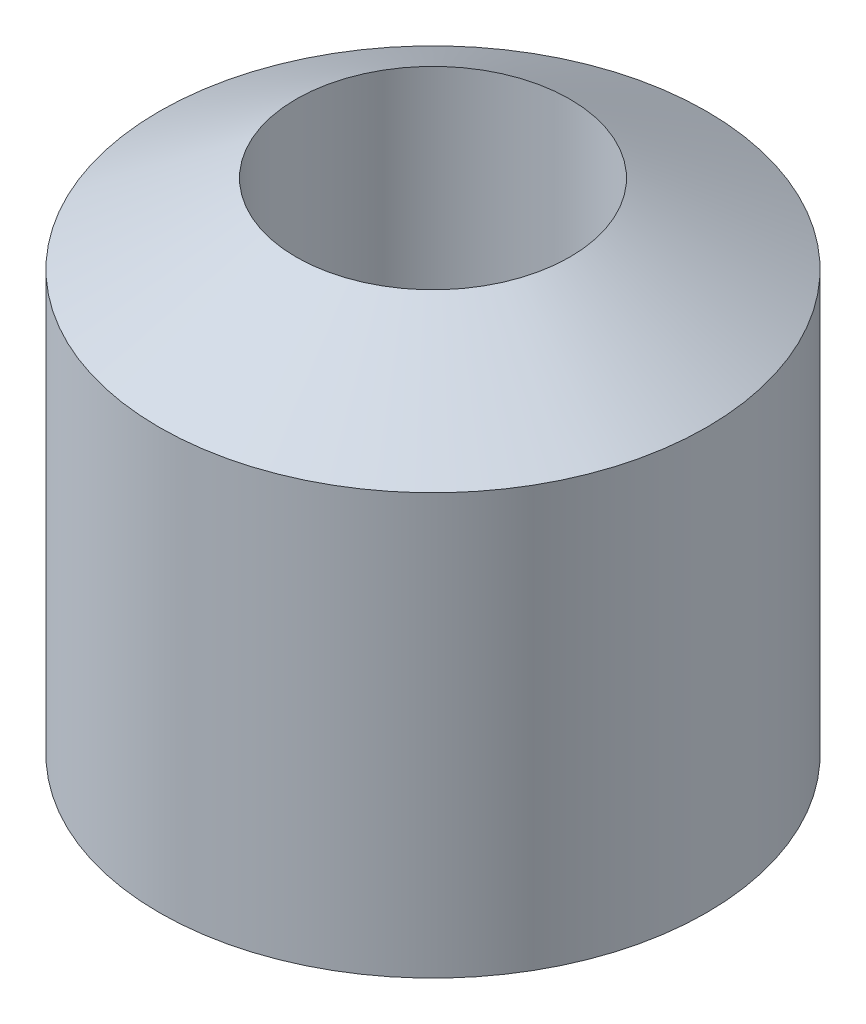
ISO-10303-21;
HEADER;
FILE_DESCRIPTION(('STEP AP214'),'2;1');
FILE_NAME('part.step','',(''),(''),'','','');
FILE_SCHEMA(('AUTOMOTIVE_DESIGN { 1 0 10303 214 1 1 1 1 }'));
ENDSEC;
DATA;
#1=APPLICATION_CONTEXT('core data for automotive mechanical design processes');
#2=APPLICATION_PROTOCOL_DEFINITION('international standard','automotive_design',2000,#1);
#3=PRODUCT_CONTEXT('',#1,'mechanical');
#4=PRODUCT('Part','Part','',(#3));
#5=PRODUCT_RELATED_PRODUCT_CATEGORY('part','',(#4));
#6=PRODUCT_DEFINITION_FORMATION('','',#4);
#7=PRODUCT_DEFINITION_CONTEXT('part definition',#1,'design');
#8=PRODUCT_DEFINITION('design','',#6,#7);
#9=PRODUCT_DEFINITION_SHAPE('','',#8);
#10=(LENGTH_UNIT() NAMED_UNIT(*) SI_UNIT(.MILLI.,.METRE.));
#11=(NAMED_UNIT(*) PLANE_ANGLE_UNIT() SI_UNIT($,.RADIAN.));
#12=(NAMED_UNIT(*) SI_UNIT($,.STERADIAN.) SOLID_ANGLE_UNIT());
#13=UNCERTAINTY_MEASURE_WITH_UNIT(LENGTH_MEASURE(1.E-05),#10,'distance_accuracy_value','');
#14=(GEOMETRIC_REPRESENTATION_CONTEXT(3) GLOBAL_UNCERTAINTY_ASSIGNED_CONTEXT((#13)) GLOBAL_UNIT_ASSIGNED_CONTEXT((#10,
#11,#12)) REPRESENTATION_CONTEXT('',''));
#15=CARTESIAN_POINT('',(0.,0.,0.));
#16=DIRECTION('',(0.,0.,1.));
#17=DIRECTION('',(1.,0.,0.));
#18=AXIS2_PLACEMENT_3D('',#15,#16,#17);
#19=CARTESIAN_POINT('',(0.,45.9145579594482,0.));
#20=DIRECTION('',(0.,1.,0.));
#21=DIRECTION('',(0.,0.,1.));
#22=AXIS2_PLACEMENT_3D('',#19,#20,#21);
#23=CYLINDRICAL_SURFACE('',#22,14.);
#24=CARTESIAN_POINT('',(0.,-29.5829037686547,0.));
#25=DIRECTION('',(0.,1.,0.));
#26=DIRECTION('',(0.,0.,1.));
#27=AXIS2_PLACEMENT_3D('',#24,#25,#26);
#28=CIRCLE('',#27,14.);
#29=CARTESIAN_POINT('',(0.,-29.5829037686547,14.));
#30=VERTEX_POINT('',#29);
#31=EDGE_CURVE('E10',#30,#30,#28,.T.);
#32=ORIENTED_EDGE('',*,*,#31,.F.);
#33=EDGE_LOOP('',(#32));
#34=FACE_BOUND('',#33,.T.);
#35=CARTESIAN_POINT('',(0.,29.5829037686547,0.));
#36=DIRECTION('',(0.,1.,0.));
#37=DIRECTION('',(0.,0.,1.));
#38=AXIS2_PLACEMENT_3D('',#35,#36,#37);
#39=CIRCLE('',#38,14.);
#40=CARTESIAN_POINT('',(0.,29.5829037686547,14.));
#41=VERTEX_POINT('',#40);
#42=EDGE_CURVE('E45',#41,#41,#39,.T.);
#43=ORIENTED_EDGE('',*,*,#42,.T.);
#44=EDGE_LOOP('',(#43));
#45=FACE_BOUND('',#44,.T.);
#46=ADVANCED_FACE('F31',(#34,#45),#23,.F.);
#47=CARTESIAN_POINT('',(0.,-29.5829037686547,0.));
#48=DIRECTION('',(0.,1.,0.));
#49=DIRECTION('',(0.,0.,1.));
#50=AXIS2_PLACEMENT_3D('',#47,#48,#49);
#51=CONICAL_SURFACE('',#50,14.,1.0471975511966);
#52=CARTESIAN_POINT('',(0.,-21.5,0.));
#53=DIRECTION('',(0.,1.,0.));
#54=DIRECTION('',(0.,0.,1.));
#55=AXIS2_PLACEMENT_3D('',#52,#53,#54);
#56=CIRCLE('',#55,28.);
#57=CARTESIAN_POINT('',(0.,-21.5,28.));
#58=VERTEX_POINT('',#57);
#59=EDGE_CURVE('E37',#58,#58,#56,.T.);
#60=ORIENTED_EDGE('',*,*,#59,.F.);
#61=EDGE_LOOP('',(#60));
#62=FACE_BOUND('',#61,.T.);
#63=ORIENTED_EDGE('',*,*,#31,.T.);
#64=EDGE_LOOP('',(#63));
#65=FACE_BOUND('',#64,.T.);
#66=ADVANCED_FACE('F60',(#62,#65),#51,.T.);
#67=CARTESIAN_POINT('',(0.,45.9145579594482,0.));
#68=DIRECTION('',(0.,1.,0.));
#69=DIRECTION('',(0.,0.,1.));
#70=AXIS2_PLACEMENT_3D('',#67,#68,#69);
#71=CYLINDRICAL_SURFACE('',#70,28.);
#72=CARTESIAN_POINT('',(0.,21.5,0.));
#73=DIRECTION('',(0.,1.,0.));
#74=DIRECTION('',(0.,0.,1.));
#75=AXIS2_PLACEMENT_3D('',#72,#73,#74);
#76=CIRCLE('',#75,28.);
#77=CARTESIAN_POINT('',(0.,21.5,28.));
#78=VERTEX_POINT('',#77);
#79=EDGE_CURVE('E41',#78,#78,#76,.T.);
#80=ORIENTED_EDGE('',*,*,#79,.F.);
#81=EDGE_LOOP('',(#80));
#82=FACE_BOUND('',#81,.T.);
#83=ORIENTED_EDGE('',*,*,#59,.T.);
#84=EDGE_LOOP('',(#83));
#85=FACE_BOUND('',#84,.T.);
#86=ADVANCED_FACE('F55',(#82,#85),#71,.T.);
#87=CARTESIAN_POINT('',(0.,21.5,0.));
#88=DIRECTION('',(0.,-1.,0.));
#89=DIRECTION('',(0.,0.,-1.));
#90=AXIS2_PLACEMENT_3D('',#87,#88,#89);
#91=CONICAL_SURFACE('',#90,28.,1.0471975511966);
#92=ORIENTED_EDGE('',*,*,#42,.F.);
#93=EDGE_LOOP('',(#92));
#94=FACE_BOUND('',#93,.T.);
#95=ORIENTED_EDGE('',*,*,#79,.T.);
#96=EDGE_LOOP('',(#95));
#97=FACE_BOUND('',#96,.T.);
#98=ADVANCED_FACE('F52',(#94,#97),#91,.T.);
#99=CLOSED_SHELL('',(#46,#66,#86,#98));
#100=MANIFOLD_SOLID_BREP('B2',#99);
#101=ADVANCED_BREP_SHAPE_REPRESENTATION('',(#18,#100),#14);
#102=SHAPE_DEFINITION_REPRESENTATION(#9,#101);
ENDSEC;
END-ISO-10303-21;
